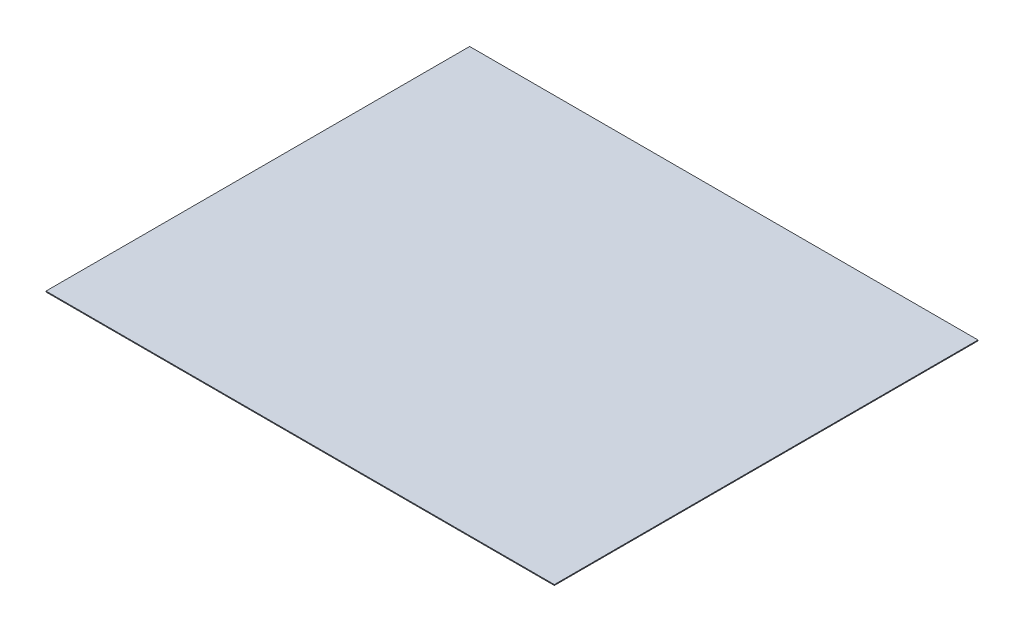
ISO-10303-21;
HEADER;
FILE_DESCRIPTION(('STEP AP214'),'2;1');
FILE_NAME('part.step','',(''),(''),'','','');
FILE_SCHEMA(('AUTOMOTIVE_DESIGN { 1 0 10303 214 1 1 1 1 }'));
ENDSEC;
DATA;
#1=APPLICATION_CONTEXT('core data for automotive mechanical design processes');
#2=APPLICATION_PROTOCOL_DEFINITION('international standard','automotive_design',2000,#1);
#3=PRODUCT_CONTEXT('',#1,'mechanical');
#4=PRODUCT('Part','Part','',(#3));
#5=PRODUCT_RELATED_PRODUCT_CATEGORY('part','',(#4));
#6=PRODUCT_DEFINITION_FORMATION('','',#4);
#7=PRODUCT_DEFINITION_CONTEXT('part definition',#1,'design');
#8=PRODUCT_DEFINITION('design','',#6,#7);
#9=PRODUCT_DEFINITION_SHAPE('','',#8);
#10=(LENGTH_UNIT() NAMED_UNIT(*) SI_UNIT(.MILLI.,.METRE.));
#11=(NAMED_UNIT(*) PLANE_ANGLE_UNIT() SI_UNIT($,.RADIAN.));
#12=(NAMED_UNIT(*) SI_UNIT($,.STERADIAN.) SOLID_ANGLE_UNIT());
#13=UNCERTAINTY_MEASURE_WITH_UNIT(LENGTH_MEASURE(1.E-05),#10,'distance_accuracy_value','');
#14=(GEOMETRIC_REPRESENTATION_CONTEXT(3) GLOBAL_UNCERTAINTY_ASSIGNED_CONTEXT((#13)) GLOBAL_UNIT_ASSIGNED_CONTEXT((#10,
#11,#12)) REPRESENTATION_CONTEXT('',''));
#15=CARTESIAN_POINT('',(0.,0.,0.));
#16=DIRECTION('',(0.,0.,1.));
#17=DIRECTION('',(1.,0.,0.));
#18=AXIS2_PLACEMENT_3D('',#15,#16,#17);
#19=CARTESIAN_POINT('',(900.,3.,-750.));
#20=DIRECTION('',(-1.,0.,0.));
#21=DIRECTION('',(0.,0.,1.));
#22=AXIS2_PLACEMENT_3D('',#19,#20,#21);
#23=PLANE('',#22);
#24=DIRECTION('',(0.,0.,-1.));
#25=VECTOR('',#24,1.);
#26=CARTESIAN_POINT('',(900.,0.,-750.));
#27=LINE('',#26,#25);
#28=CARTESIAN_POINT('',(900.,0.,750.));
#29=VERTEX_POINT('',#28);
#30=CARTESIAN_POINT('',(900.,0.,-750.));
#31=VERTEX_POINT('',#30);
#32=EDGE_CURVE('E97',#29,#31,#27,.T.);
#33=ORIENTED_EDGE('',*,*,#32,.T.);
#34=DIRECTION('',(0.,-1.,0.));
#35=VECTOR('',#34,1.);
#36=CARTESIAN_POINT('',(900.,3.,-750.));
#37=LINE('',#36,#35);
#38=CARTESIAN_POINT('',(900.,3.,-750.));
#39=VERTEX_POINT('',#38);
#40=EDGE_CURVE('E11',#39,#31,#37,.T.);
#41=ORIENTED_EDGE('',*,*,#40,.F.);
#42=DIRECTION('',(0.,0.,-1.));
#43=VECTOR('',#42,1.);
#44=CARTESIAN_POINT('',(900.,3.,-750.));
#45=LINE('',#44,#43);
#46=CARTESIAN_POINT('',(900.,3.,750.));
#47=VERTEX_POINT('',#46);
#48=EDGE_CURVE('E85',#47,#39,#45,.T.);
#49=ORIENTED_EDGE('',*,*,#48,.F.);
#50=DIRECTION('',(0.,-1.,0.));
#51=VECTOR('',#50,1.);
#52=CARTESIAN_POINT('',(900.,3.,750.));
#53=LINE('',#52,#51);
#54=EDGE_CURVE('E93',#47,#29,#53,.T.);
#55=ORIENTED_EDGE('',*,*,#54,.T.);
#56=EDGE_LOOP('',(#33,#41,#49,#55));
#57=FACE_BOUND('',#56,.T.);
#58=ADVANCED_FACE('F34',(#57),#23,.F.);
#59=CARTESIAN_POINT('',(-900.,3.,-750.));
#60=DIRECTION('',(0.,0.,1.));
#61=DIRECTION('',(1.,0.,0.));
#62=AXIS2_PLACEMENT_3D('',#59,#60,#61);
#63=PLANE('',#62);
#64=DIRECTION('',(-1.,0.,0.));
#65=VECTOR('',#64,1.);
#66=CARTESIAN_POINT('',(-900.,0.,-750.));
#67=LINE('',#66,#65);
#68=CARTESIAN_POINT('',(-900.,0.,-750.));
#69=VERTEX_POINT('',#68);
#70=EDGE_CURVE('E89',#31,#69,#67,.T.);
#71=ORIENTED_EDGE('',*,*,#70,.T.);
#72=DIRECTION('',(0.,-1.,0.));
#73=VECTOR('',#72,1.);
#74=CARTESIAN_POINT('',(-900.,3.,-750.));
#75=LINE('',#74,#73);
#76=CARTESIAN_POINT('',(-900.,3.,-750.));
#77=VERTEX_POINT('',#76);
#78=EDGE_CURVE('E42',#77,#69,#75,.T.);
#79=ORIENTED_EDGE('',*,*,#78,.F.);
#80=DIRECTION('',(-1.,0.,0.));
#81=VECTOR('',#80,1.);
#82=CARTESIAN_POINT('',(-900.,3.,-750.));
#83=LINE('',#82,#81);
#84=EDGE_CURVE('E80',#39,#77,#83,.T.);
#85=ORIENTED_EDGE('',*,*,#84,.F.);
#86=ORIENTED_EDGE('',*,*,#40,.T.);
#87=EDGE_LOOP('',(#71,#79,#85,#86));
#88=FACE_BOUND('',#87,.T.);
#89=ADVANCED_FACE('F88',(#88),#63,.F.);
#90=CARTESIAN_POINT('',(-900.,3.,-750.));
#91=DIRECTION('',(1.,0.,0.));
#92=DIRECTION('',(0.,0.,-1.));
#93=AXIS2_PLACEMENT_3D('',#90,#91,#92);
#94=PLANE('',#93);
#95=DIRECTION('',(0.,0.,1.));
#96=VECTOR('',#95,1.);
#97=CARTESIAN_POINT('',(-900.,0.,-750.));
#98=LINE('',#97,#96);
#99=CARTESIAN_POINT('',(-900.,0.,750.));
#100=VERTEX_POINT('',#99);
#101=EDGE_CURVE('E67',#69,#100,#98,.T.);
#102=ORIENTED_EDGE('',*,*,#101,.T.);
#103=DIRECTION('',(0.,-1.,0.));
#104=VECTOR('',#103,1.);
#105=CARTESIAN_POINT('',(-900.,3.,750.));
#106=LINE('',#105,#104);
#107=CARTESIAN_POINT('',(-900.,3.,750.));
#108=VERTEX_POINT('',#107);
#109=EDGE_CURVE('E90',#108,#100,#106,.T.);
#110=ORIENTED_EDGE('',*,*,#109,.F.);
#111=DIRECTION('',(0.,0.,1.));
#112=VECTOR('',#111,1.);
#113=CARTESIAN_POINT('',(-900.,3.,-750.));
#114=LINE('',#113,#112);
#115=EDGE_CURVE('E83',#77,#108,#114,.T.);
#116=ORIENTED_EDGE('',*,*,#115,.F.);
#117=ORIENTED_EDGE('',*,*,#78,.T.);
#118=EDGE_LOOP('',(#102,#110,#116,#117));
#119=FACE_BOUND('',#118,.T.);
#120=ADVANCED_FACE('F91',(#119),#94,.F.);
#121=CARTESIAN_POINT('',(-900.,3.,750.));
#122=DIRECTION('',(0.,0.,-1.));
#123=DIRECTION('',(-1.,0.,0.));
#124=AXIS2_PLACEMENT_3D('',#121,#122,#123);
#125=PLANE('',#124);
#126=DIRECTION('',(1.,0.,0.));
#127=VECTOR('',#126,1.);
#128=CARTESIAN_POINT('',(-900.,0.,750.));
#129=LINE('',#128,#127);
#130=EDGE_CURVE('E73',#100,#29,#129,.T.);
#131=ORIENTED_EDGE('',*,*,#130,.T.);
#132=ORIENTED_EDGE('',*,*,#54,.F.);
#133=DIRECTION('',(1.,0.,0.));
#134=VECTOR('',#133,1.);
#135=CARTESIAN_POINT('',(-900.,3.,750.));
#136=LINE('',#135,#134);
#137=EDGE_CURVE('E50',#108,#47,#136,.T.);
#138=ORIENTED_EDGE('',*,*,#137,.F.);
#139=ORIENTED_EDGE('',*,*,#109,.T.);
#140=EDGE_LOOP('',(#131,#132,#138,#139));
#141=FACE_BOUND('',#140,.T.);
#142=ADVANCED_FACE('F104',(#141),#125,.F.);
#143=CARTESIAN_POINT('',(0.,3.,0.));
#144=DIRECTION('',(0.,1.,0.));
#145=DIRECTION('',(0.,0.,1.));
#146=AXIS2_PLACEMENT_3D('',#143,#144,#145);
#147=PLANE('',#146);
#148=ORIENTED_EDGE('',*,*,#48,.T.);
#149=ORIENTED_EDGE('',*,*,#84,.T.);
#150=ORIENTED_EDGE('',*,*,#115,.T.);
#151=ORIENTED_EDGE('',*,*,#137,.T.);
#152=EDGE_LOOP('',(#148,#149,#150,#151));
#153=FACE_BOUND('',#152,.T.);
#154=ADVANCED_FACE('F81',(#153),#147,.T.);
#155=CARTESIAN_POINT('',(0.,0.,0.));
#156=DIRECTION('',(0.,1.,0.));
#157=DIRECTION('',(0.,0.,1.));
#158=AXIS2_PLACEMENT_3D('',#155,#156,#157);
#159=PLANE('',#158);
#160=ORIENTED_EDGE('',*,*,#32,.F.);
#161=ORIENTED_EDGE('',*,*,#130,.F.);
#162=ORIENTED_EDGE('',*,*,#101,.F.);
#163=ORIENTED_EDGE('',*,*,#70,.F.);
#164=EDGE_LOOP('',(#160,#161,#162,#163));
#165=FACE_BOUND('',#164,.T.);
#166=ADVANCED_FACE('F107',(#165),#159,.F.);
#167=CLOSED_SHELL('',(#58,#89,#120,#142,#154,#166));
#168=MANIFOLD_SOLID_BREP('B2',#167);
#169=ADVANCED_BREP_SHAPE_REPRESENTATION('',(#18,#168),#14);
#170=SHAPE_DEFINITION_REPRESENTATION(#9,#169);
ENDSEC;
END-ISO-10303-21;
